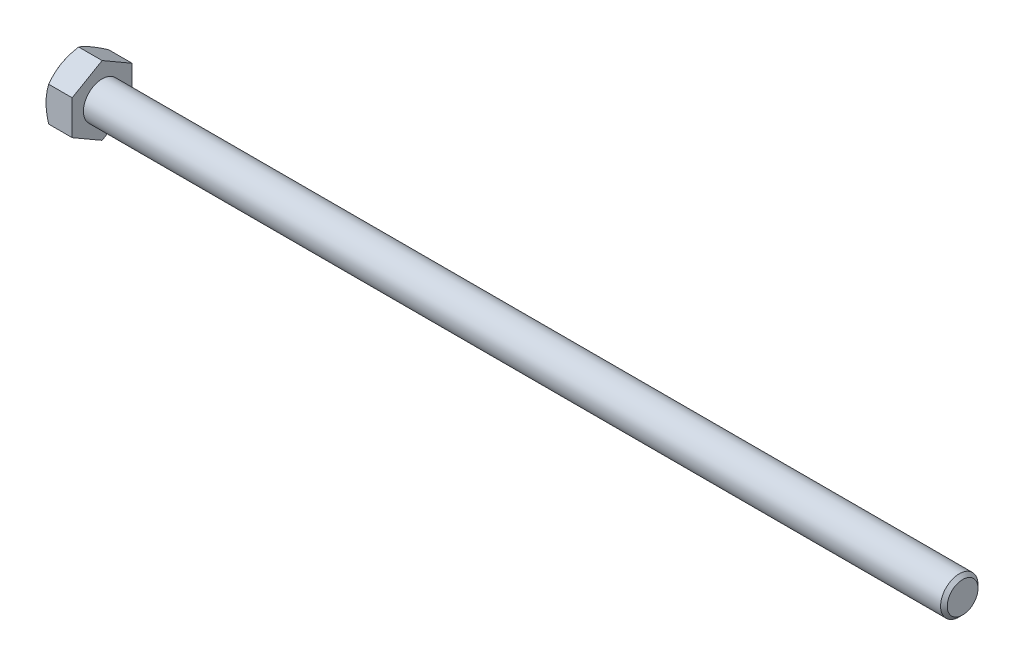
ISO-10303-21;
HEADER;
FILE_DESCRIPTION(('STEP AP214'),'2;1');
FILE_NAME('part.step','',(''),(''),'','','');
FILE_SCHEMA(('AUTOMOTIVE_DESIGN { 1 0 10303 214 1 1 1 1 }'));
ENDSEC;
DATA;
#1=APPLICATION_CONTEXT('core data for automotive mechanical design processes');
#2=APPLICATION_PROTOCOL_DEFINITION('international standard','automotive_design',2000,#1);
#3=PRODUCT_CONTEXT('',#1,'mechanical');
#4=PRODUCT('Part','Part','',(#3));
#5=PRODUCT_RELATED_PRODUCT_CATEGORY('part','',(#4));
#6=PRODUCT_DEFINITION_FORMATION('','',#4);
#7=PRODUCT_DEFINITION_CONTEXT('part definition',#1,'design');
#8=PRODUCT_DEFINITION('design','',#6,#7);
#9=PRODUCT_DEFINITION_SHAPE('','',#8);
#10=(LENGTH_UNIT() NAMED_UNIT(*) SI_UNIT(.MILLI.,.METRE.));
#11=(NAMED_UNIT(*) PLANE_ANGLE_UNIT() SI_UNIT($,.RADIAN.));
#12=(NAMED_UNIT(*) SI_UNIT($,.STERADIAN.) SOLID_ANGLE_UNIT());
#13=UNCERTAINTY_MEASURE_WITH_UNIT(LENGTH_MEASURE(1.E-05),#10,'distance_accuracy_value','');
#14=(GEOMETRIC_REPRESENTATION_CONTEXT(3) GLOBAL_UNCERTAINTY_ASSIGNED_CONTEXT((#13)) GLOBAL_UNIT_ASSIGNED_CONTEXT((#10,
#11,#12)) REPRESENTATION_CONTEXT('',''));
#15=CARTESIAN_POINT('',(0.,0.,0.));
#16=DIRECTION('',(0.,0.,1.));
#17=DIRECTION('',(1.,0.,0.));
#18=AXIS2_PLACEMENT_3D('',#15,#16,#17);
#19=CARTESIAN_POINT('',(3.5,2.3094010767585,-4.));
#20=DIRECTION('',(0.,-0.866025403784438,0.500000000000001));
#21=DIRECTION('',(0.,-0.500000000000001,-0.866025403784438));
#22=AXIS2_PLACEMENT_3D('',#19,#20,#21);
#23=PLANE('',#22);
#24=CARTESIAN_POINT('',(0.357332259074765,4.61891762357085,0.0002));
#25=CARTESIAN_POINT('',(0.298717873648281,4.51743148381381,-0.175579150323228));
#26=CARTESIAN_POINT('',(0.245410321462261,4.41506932144052,-0.352875616326381));
#27=CARTESIAN_POINT('',(0.152361670746403,4.2085725054774,-0.710538593175706));
#28=CARTESIAN_POINT('',(0.112653489029704,4.10443418285647,-0.89091145897015));
#29=CARTESIAN_POINT('',(0.0508422152802794,3.89744813015756,-1.24942181870279));
#30=CARTESIAN_POINT('',(0.0283277315228895,3.7946322465506,-1.42750415293514));
#31=CARTESIAN_POINT('',(0.00145062314658258,3.58851671999023,-1.78450671716651));
#32=CARTESIAN_POINT('',(-0.00293425857305618,3.48521782616117,-1.9634256496441));
#33=CARTESIAN_POINT('',(0.00619007293997031,3.29219970504619,-2.29774284219673));
#34=CARTESIAN_POINT('',(0.017458953987994,3.20245157692487,-2.45319115998706));
#35=CARTESIAN_POINT('',(0.0531739907981923,3.02354002635497,-2.76307505563505));
#36=CARTESIAN_POINT('',(0.0776323457115318,2.93437722268073,-2.91750956174413));
#37=CARTESIAN_POINT('',(0.138776064919287,2.75509682012354,-3.22803232777458));
#38=CARTESIAN_POINT('',(0.175720603654861,2.6650019108942,-3.3840812880631));
#39=CARTESIAN_POINT('',(0.259570072548024,2.48615580200001,-3.69385183540384));
#40=CARTESIAN_POINT('',(0.306455302212736,2.39740231122585,-3.84757739077378));
#41=CARTESIAN_POINT('',(0.357332259074763,2.30928560670467,-4.0002));
#42=B_SPLINE_CURVE_WITH_KNOTS('',3,(#24,#25,#26,#27,#28,#29,#30,#31,#32,#33,#34,#35,#36,#37,#38,
#39,#40,#41),.UNSPECIFIED.,.F.,.F.,(4,2,2,2,2,2,2,2,4),(0.,0.634047835695966,1.26961969224543,
1.88946157213122,2.50854226669297,3.04757825393386,3.58711366126903,4.13861653143764,
4.68903648037743),.UNSPECIFIED.);
#43=CARTESIAN_POINT('',(0.357265589908161,4.61880215351701,0.));
#44=VERTEX_POINT('',#43);
#45=CARTESIAN_POINT('',(0.,3.46410161513775,-2.));
#46=VERTEX_POINT('',#45);
#47=EDGE_CURVE('E50',#44,#46,#42,.T.);
#48=ORIENTED_EDGE('',*,*,#47,.F.);
#49=DIRECTION('',(-1.,0.,0.));
#50=VECTOR('',#49,1.);
#51=CARTESIAN_POINT('',(3.5,4.61880215351701,0.));
#52=LINE('',#51,#50);
#53=CARTESIAN_POINT('',(3.5,4.61880215351701,0.));
#54=VERTEX_POINT('',#53);
#55=EDGE_CURVE('E146',#54,#44,#52,.T.);
#56=ORIENTED_EDGE('',*,*,#55,.F.);
#57=DIRECTION('',(0.,0.500000000000001,0.866025403784438));
#58=VECTOR('',#57,1.);
#59=CARTESIAN_POINT('',(3.5,2.3094010767585,-4.));
#60=LINE('',#59,#58);
#61=CARTESIAN_POINT('',(3.5,2.3094010767585,-4.));
#62=VERTEX_POINT('',#61);
#63=EDGE_CURVE('E231',#62,#54,#60,.T.);
#64=ORIENTED_EDGE('',*,*,#63,.F.);
#65=DIRECTION('',(-1.,0.,0.));
#66=VECTOR('',#65,1.);
#67=CARTESIAN_POINT('',(3.5,2.3094010767585,-4.));
#68=LINE('',#67,#66);
#69=CARTESIAN_POINT('',(0.357265589908158,2.3094010767585,-4.));
#70=VERTEX_POINT('',#69);
#71=EDGE_CURVE('E134',#62,#70,#68,.T.);
#72=ORIENTED_EDGE('',*,*,#71,.T.);
#73=EDGE_CURVE('E128',#46,#70,#42,.T.);
#74=ORIENTED_EDGE('',*,*,#73,.F.);
#75=EDGE_LOOP('',(#48,#56,#64,#72,#74));
#76=FACE_BOUND('',#75,.T.);
#77=ADVANCED_FACE('F34',(#76),#23,.F.);
#78=CARTESIAN_POINT('',(3.5,4.61880215351701,0.));
#79=DIRECTION('',(0.,-0.866025403784438,-0.500000000000001));
#80=DIRECTION('',(0.,0.500000000000001,-0.866025403784438));
#81=AXIS2_PLACEMENT_3D('',#78,#79,#80);
#82=PLANE('',#81);
#83=CARTESIAN_POINT('',(0.357332259074762,2.30928560670466,4.0002));
#84=CARTESIAN_POINT('',(0.298717873648277,2.4107717464617,3.82442084967677));
#85=CARTESIAN_POINT('',(0.245410321462258,2.51313390883499,3.64712438367362));
#86=CARTESIAN_POINT('',(0.152361670746401,2.71963072479811,3.28946140682429));
#87=CARTESIAN_POINT('',(0.112653489029703,2.82376904741904,3.10908854102985));
#88=CARTESIAN_POINT('',(0.0508422152802784,3.03075510011795,2.75057818129721));
#89=CARTESIAN_POINT('',(0.0283277315228881,3.13357098372492,2.57249584706486));
#90=CARTESIAN_POINT('',(0.00145062314658145,3.33968651028528,2.21549328283349));
#91=CARTESIAN_POINT('',(-0.00293425857305672,3.44298540411434,2.0365743503559));
#92=CARTESIAN_POINT('',(0.00619007293997055,3.63600352522932,1.70225715780327));
#93=CARTESIAN_POINT('',(0.0174589539879945,3.72575165335065,1.54680884001294));
#94=CARTESIAN_POINT('',(0.0531739907981932,3.90466320392054,1.23692494436495));
#95=CARTESIAN_POINT('',(0.0776323457115329,3.99382600759479,1.08249043825587));
#96=CARTESIAN_POINT('',(0.138776064919289,4.17310641015197,0.771967672225423));
#97=CARTESIAN_POINT('',(0.175720603654863,4.26320131938131,0.615918711936898));
#98=CARTESIAN_POINT('',(0.259570072548026,4.44204742827551,0.30614816459616));
#99=CARTESIAN_POINT('',(0.306455302212738,4.53080091904967,0.15242260922622));
#100=CARTESIAN_POINT('',(0.357332259074765,4.61891762357085,-0.000200000000000061));
#101=B_SPLINE_CURVE_WITH_KNOTS('',3,(#83,#84,#85,#86,#87,#88,#89,#90,#91,#92,#93,#94,#95,#96,
#97,#98,#99,#100),.UNSPECIFIED.,.F.,.F.,(4,2,2,2,2,2,2,2,4),(0.,0.634047835695965,
1.26961969224543,1.88946157213122,2.50854226669297,3.04757825393385,3.58711366126903,
4.13861653143764,4.68903648037743),.UNSPECIFIED.);
#102=CARTESIAN_POINT('',(0.357265589908157,2.3094010767585,4.));
#103=VERTEX_POINT('',#102);
#104=CARTESIAN_POINT('',(0.,3.46410161513775,2.));
#105=VERTEX_POINT('',#104);
#106=EDGE_CURVE('E57',#103,#105,#101,.T.);
#107=ORIENTED_EDGE('',*,*,#106,.F.);
#108=DIRECTION('',(-1.,0.,0.));
#109=VECTOR('',#108,1.);
#110=CARTESIAN_POINT('',(3.5,2.3094010767585,4.));
#111=LINE('',#110,#109);
#112=CARTESIAN_POINT('',(3.5,2.3094010767585,4.));
#113=VERTEX_POINT('',#112);
#114=EDGE_CURVE('E144',#113,#103,#111,.T.);
#115=ORIENTED_EDGE('',*,*,#114,.F.);
#116=DIRECTION('',(0.,-0.500000000000001,0.866025403784438));
#117=VECTOR('',#116,1.);
#118=CARTESIAN_POINT('',(3.5,4.61880215351701,0.));
#119=LINE('',#118,#117);
#120=EDGE_CURVE('E229',#54,#113,#119,.T.);
#121=ORIENTED_EDGE('',*,*,#120,.F.);
#122=ORIENTED_EDGE('',*,*,#55,.T.);
#123=EDGE_CURVE('E161',#105,#44,#101,.T.);
#124=ORIENTED_EDGE('',*,*,#123,.F.);
#125=EDGE_LOOP('',(#107,#115,#121,#122,#124));
#126=FACE_BOUND('',#125,.T.);
#127=ADVANCED_FACE('F167',(#126),#82,.F.);
#128=CARTESIAN_POINT('',(3.5,2.3094010767585,4.));
#129=DIRECTION('',(0.,0.,-1.));
#130=DIRECTION('',(0.,1.,0.));
#131=AXIS2_PLACEMENT_3D('',#128,#129,#130);
#132=PLANE('',#131);
#133=CARTESIAN_POINT('',(2.00011120589741,-6.30203842761112,4.));
#134=CARTESIAN_POINT('',(1.91454696498873,-6.12645846908574,4.));
#135=CARTESIAN_POINT('',(1.8297751587799,-5.95048585830455,4.));
#136=CARTESIAN_POINT('',(1.66226027831943,-5.59754684504876,4.));
#137=CARTESIAN_POINT('',(1.57951750565515,-5.42058029958677,4.));
#138=CARTESIAN_POINT('',(1.41610926315702,-5.06457985358151,4.));
#139=CARTESIAN_POINT('',(1.33545672742031,-4.88553999633136,4.));
#140=CARTESIAN_POINT('',(1.17732358085362,-4.52607013308824,4.));
#141=CARTESIAN_POINT('',(1.09984282639235,-4.34564019048467,4.));
#142=CARTESIAN_POINT('',(0.946328318347805,-3.97695712450866,4.));
#143=CARTESIAN_POINT('',(0.87043270452968,-3.7886461766802,4.));
#144=CARTESIAN_POINT('',(0.72415021597338,-3.40985798992394,4.));
#145=CARTESIAN_POINT('',(0.653763945273163,-3.21938051607554,4.));
#146=CARTESIAN_POINT('',(0.520275623504076,-2.83628177128504,4.));
#147=CARTESIAN_POINT('',(0.457159651374148,-2.64366539864627,4.));
#148=CARTESIAN_POINT('',(0.340171517554836,-2.25567134331568,4.));
#149=CARTESIAN_POINT('',(0.286296547637715,-2.06029451909569,4.));
#150=CARTESIAN_POINT('',(0.190596079795565,-1.66775019580151,4.));
#151=CARTESIAN_POINT('',(0.148703055516463,-1.47059946092578,4.));
#152=CARTESIAN_POINT('',(0.0792701945625797,-1.07374632347739,4.));
#153=CARTESIAN_POINT('',(0.0517287925825725,-0.874044201615005,4.));
#154=CARTESIAN_POINT('',(0.0135517369810976,-0.475733691865659,4.));
#155=CARTESIAN_POINT('',(0.0026910656815028,-0.277147418102507,4.));
#156=CARTESIAN_POINT('',(-0.00180277185473722,0.120241437274126,4.));
#157=CARTESIAN_POINT('',(0.00456430935448255,0.319044021953529,4.));
#158=CARTESIAN_POINT('',(0.0293199842587317,0.653649133068296,4.));
#159=CARTESIAN_POINT('',(0.0433487696608963,0.789796206499813,4.));
#160=CARTESIAN_POINT('',(0.0786650587211741,1.0611517992991,4.));
#161=CARTESIAN_POINT('',(0.099953465399782,1.1963601997699,4.));
#162=CARTESIAN_POINT('',(0.173595113230304,1.60036108975571,4.));
#163=CARTESIAN_POINT('',(0.23571360986528,1.86739658303733,4.));
#164=CARTESIAN_POINT('',(0.344187907647023,2.26690842404959,4.));
#165=CARTESIAN_POINT('',(0.383434484333358,2.40143348571874,4.));
#166=CARTESIAN_POINT('',(0.466191102609248,2.66917849490937,4.));
#167=CARTESIAN_POINT('',(0.509701177188776,2.80239843232332,4.));
#168=CARTESIAN_POINT('',(0.600271094434189,3.06757339383923,4.));
#169=CARTESIAN_POINT('',(0.647329943862153,3.19952876030406,4.));
#170=CARTESIAN_POINT('',(0.744425096631933,3.46233234223975,4.));
#171=CARTESIAN_POINT('',(0.794461330917678,3.59318058330843,4.));
#172=CARTESIAN_POINT('',(0.933355739925499,3.94627302392213,4.));
#173=CARTESIAN_POINT('',(1.0245987610664,4.16757823857487,4.));
#174=CARTESIAN_POINT('',(1.212472284956,4.60789849928793,4.));
#175=CARTESIAN_POINT('',(1.30910339372387,4.82691328443151,4.));
#176=CARTESIAN_POINT('',(1.50647026715799,5.26317250533757,4.));
#177=CARTESIAN_POINT('',(1.60720747010151,5.48041628821982,4.));
#178=CARTESIAN_POINT('',(1.81181128644257,5.91342831956036,4.));
#179=CARTESIAN_POINT('',(1.91567799687904,6.12919652200918,4.));
#180=CARTESIAN_POINT('',(2.12601769056008,6.55988022094135,4.));
#181=CARTESIAN_POINT('',(2.23249454580639,6.77479382248029,4.));
#182=CARTESIAN_POINT('',(2.44739203770407,7.20364803216286,4.));
#183=CARTESIAN_POINT('',(2.55581269515435,7.4175886298645,4.));
#184=CARTESIAN_POINT('',(2.88334503640576,8.05812603677698,4.));
#185=CARTESIAN_POINT('',(3.10477549508711,8.48353660654961,4.));
#186=CARTESIAN_POINT('',(3.52798949521966,9.287048305686,4.));
#187=CARTESIAN_POINT('',(3.7293579523648,9.66536913109687,4.));
#188=CARTESIAN_POINT('',(4.13451859351913,10.4207405604373,4.));
#189=CARTESIAN_POINT('',(4.33831092861572,10.7977910832854,3.99999999999999));
#190=CARTESIAN_POINT('',(4.74699525708425,11.5496417902084,3.99999999999999));
#191=CARTESIAN_POINT('',(4.9518811941786,11.9244452714923,3.99999999999999));
#192=CARTESIAN_POINT('',(5.36302659718323,12.6732594632006,3.99999999999999));
#193=CARTESIAN_POINT('',(5.56928595205573,13.0472702345667,3.99999999999999));
#194=CARTESIAN_POINT('',(5.77604503500377,13.42100281196,3.99999999999999));
#195=B_SPLINE_CURVE_WITH_KNOTS('',3,(#133,#134,#135,#136,#137,#138,#139,#140,#141,#142,#143,
#144,#145,#146,#147,#148,#149,#150,#151,#152,#153,#154,#155,#156,#157,#158,#159,#160,#161,#162,
#163,#164,#165,#166,#167,#168,#169,#170,#171,#172,#173,#174,#175,#176,#177,#178,#179,#180,#181,
#182,#183,#184,#185,#186,#187,#188,#189,#190,#191,#192,#193,#194),.UNSPECIFIED.,.F.,.F.,(4,2,2,
2,2,2,2,2,2,2,2,2,2,2,2,2,2,2,2,2,2,2,2,2,2,2,2,2,2,2,4),(0.,0.585964080082645,1.1720147339736,
1.76109183587771,2.35014223237614,2.95916537364922,3.56825519425103,4.17615863853846,
4.78387701983943,5.38809979056439,5.99225664601461,6.58818973021546,7.18413137397508,
7.59453803053126,8.00499575598947,8.82630884150173,9.2466697389851,9.66703388938199,
10.0872808210163,10.5075180094363,11.2255416710968,11.9436462552169,12.6620045748536,
13.3803851921263,14.0999050723894,14.8194326561991,16.2581595564571,17.5438734456803,
18.8296679016496,20.1111105471136,21.3924508191106),.UNSPECIFIED.);
#196=CARTESIAN_POINT('',(0.357265589908157,-2.3094010767585,4.));
#197=VERTEX_POINT('',#196);
#198=CARTESIAN_POINT('',(0.,0.,4.));
#199=VERTEX_POINT('',#198);
#200=EDGE_CURVE('E241',#197,#199,#195,.T.);
#201=ORIENTED_EDGE('',*,*,#200,.F.);
#202=DIRECTION('',(-1.,0.,0.));
#203=VECTOR('',#202,1.);
#204=CARTESIAN_POINT('',(3.5,-2.3094010767585,4.));
#205=LINE('',#204,#203);
#206=CARTESIAN_POINT('',(3.5,-2.3094010767585,4.));
#207=VERTEX_POINT('',#206);
#208=EDGE_CURVE('E136',#207,#197,#205,.T.);
#209=ORIENTED_EDGE('',*,*,#208,.F.);
#210=DIRECTION('',(0.,-1.,0.));
#211=VECTOR('',#210,1.);
#212=CARTESIAN_POINT('',(3.5,2.3094010767585,4.));
#213=LINE('',#212,#211);
#214=EDGE_CURVE('E225',#113,#207,#213,.T.);
#215=ORIENTED_EDGE('',*,*,#214,.F.);
#216=ORIENTED_EDGE('',*,*,#114,.T.);
#217=EDGE_CURVE('E183',#199,#103,#195,.T.);
#218=ORIENTED_EDGE('',*,*,#217,.F.);
#219=EDGE_LOOP('',(#201,#209,#215,#216,#218));
#220=FACE_BOUND('',#219,.T.);
#221=ADVANCED_FACE('F247',(#220),#132,.F.);
#222=CARTESIAN_POINT('',(3.5,-4.61880215351701,0.));
#223=DIRECTION('',(0.,0.866025403784438,-0.500000000000001));
#224=DIRECTION('',(0.,0.500000000000001,0.866025403784438));
#225=AXIS2_PLACEMENT_3D('',#222,#223,#224);
#226=PLANE('',#225);
#227=CARTESIAN_POINT('',(0.357332259074763,-4.61891762357084,-0.000200000000000144));
#228=CARTESIAN_POINT('',(0.298717873648279,-4.5174314838138,0.175579150323228));
#229=CARTESIAN_POINT('',(0.245410321462259,-4.41506932144052,0.35287561632638));
#230=CARTESIAN_POINT('',(0.152361670746401,-4.20857250547739,0.710538593175705));
#231=CARTESIAN_POINT('',(0.112653489029702,-4.10443418285647,0.89091145897015));
#232=CARTESIAN_POINT('',(0.0508422152802777,-3.89744813015756,1.24942181870279));
#233=CARTESIAN_POINT('',(0.0283277315228874,-3.79463224655059,1.42750415293514));
#234=CARTESIAN_POINT('',(0.00145062314658024,-3.58851671999023,1.78450671716651));
#235=CARTESIAN_POINT('',(-0.0029342585730584,-3.48521782616117,1.9634256496441));
#236=CARTESIAN_POINT('',(0.00619007293996827,-3.29219970504619,2.29774284219673));
#237=CARTESIAN_POINT('',(0.017458953987992,-3.20245157692486,2.45319115998706));
#238=CARTESIAN_POINT('',(0.0531739907981903,-3.02354002635496,2.76307505563505));
#239=CARTESIAN_POINT('',(0.0776323457115299,-2.93437722268072,2.91750956174413));
#240=CARTESIAN_POINT('',(0.138776064919285,-2.75509682012354,3.22803232777458));
#241=CARTESIAN_POINT('',(0.175720603654859,-2.6650019108942,3.3840812880631));
#242=CARTESIAN_POINT('',(0.259570072548022,-2.486155802,3.69385183540384));
#243=CARTESIAN_POINT('',(0.306455302212734,-2.39740231122584,3.84757739077378));
#244=CARTESIAN_POINT('',(0.357332259074761,-2.30928560670466,4.0002));
#245=B_SPLINE_CURVE_WITH_KNOTS('',3,(#227,#228,#229,#230,#231,#232,#233,#234,#235,#236,#237,
#238,#239,#240,#241,#242,#243,#244),.UNSPECIFIED.,.F.,.F.,(4,2,2,2,2,2,2,2,4),(0.,
0.634047835695965,1.26961969224543,1.88946157213122,2.50854226669297,3.04757825393385,
3.58711366126903,4.13861653143764,4.68903648037743),.UNSPECIFIED.);
#246=CARTESIAN_POINT('',(0.357265589908159,-4.61880215351701,0.));
#247=VERTEX_POINT('',#246);
#248=CARTESIAN_POINT('',(0.,-3.46410161513775,2.));
#249=VERTEX_POINT('',#248);
#250=EDGE_CURVE('E169',#247,#249,#245,.T.);
#251=ORIENTED_EDGE('',*,*,#250,.F.);
#252=DIRECTION('',(-1.,0.,0.));
#253=VECTOR('',#252,1.);
#254=CARTESIAN_POINT('',(3.5,-4.61880215351701,0.));
#255=LINE('',#254,#253);
#256=CARTESIAN_POINT('',(3.5,-4.61880215351701,0.));
#257=VERTEX_POINT('',#256);
#258=EDGE_CURVE('E133',#257,#247,#255,.T.);
#259=ORIENTED_EDGE('',*,*,#258,.F.);
#260=DIRECTION('',(0.,-0.500000000000001,-0.866025403784438));
#261=VECTOR('',#260,1.);
#262=CARTESIAN_POINT('',(3.5,-4.61880215351701,0.));
#263=LINE('',#262,#261);
#264=EDGE_CURVE('E223',#207,#257,#263,.T.);
#265=ORIENTED_EDGE('',*,*,#264,.F.);
#266=ORIENTED_EDGE('',*,*,#208,.T.);
#267=EDGE_CURVE('E171',#249,#197,#245,.T.);
#268=ORIENTED_EDGE('',*,*,#267,.F.);
#269=EDGE_LOOP('',(#251,#259,#265,#266,#268));
#270=FACE_BOUND('',#269,.T.);
#271=ADVANCED_FACE('F219',(#270),#226,.F.);
#272=CARTESIAN_POINT('',(3.5,-2.3094010767585,-4.));
#273=DIRECTION('',(0.,0.866025403784439,0.5));
#274=DIRECTION('',(0.,-0.5,0.866025403784439));
#275=AXIS2_PLACEMENT_3D('',#272,#273,#274);
#276=PLANE('',#275);
#277=CARTESIAN_POINT('',(0.357332259074764,-2.30928560670467,-4.0002));
#278=CARTESIAN_POINT('',(0.298717873648281,-2.41077174646171,-3.82442084967677));
#279=CARTESIAN_POINT('',(0.245410321462261,-2.513133908835,-3.64712438367362));
#280=CARTESIAN_POINT('',(0.152361670746402,-2.71963072479812,-3.2894614068243));
#281=CARTESIAN_POINT('',(0.112653489029703,-2.82376904741904,-3.10908854102985));
#282=CARTESIAN_POINT('',(0.0508422152802788,-3.03075510011795,-2.75057818129721));
#283=CARTESIAN_POINT('',(0.0283277315228891,-3.13357098372492,-2.57249584706486));
#284=CARTESIAN_POINT('',(0.00145062314658242,-3.33968651028528,-2.21549328283349));
#285=CARTESIAN_POINT('',(-0.0029342585730564,-3.44298540411434,-2.0365743503559));
#286=CARTESIAN_POINT('',(0.00619007293997026,-3.63600352522932,-1.70225715780327));
#287=CARTESIAN_POINT('',(0.0174589539879941,-3.72575165335065,-1.54680884001294));
#288=CARTESIAN_POINT('',(0.0531739907981925,-3.90466320392054,-1.23692494436495));
#289=CARTESIAN_POINT('',(0.077632345711532,-3.99382600759478,-1.08249043825587));
#290=CARTESIAN_POINT('',(0.138776064919287,-4.17310641015197,-0.771967672225423));
#291=CARTESIAN_POINT('',(0.175720603654861,-4.26320131938131,-0.615918711936899));
#292=CARTESIAN_POINT('',(0.259570072548024,-4.4420474282755,-0.306148164596161));
#293=CARTESIAN_POINT('',(0.306455302212736,-4.53080091904966,-0.152422609226221));
#294=CARTESIAN_POINT('',(0.357332259074763,-4.61891762357084,0.00019999999999975));
#295=B_SPLINE_CURVE_WITH_KNOTS('',3,(#277,#278,#279,#280,#281,#282,#283,#284,#285,#286,#287,
#288,#289,#290,#291,#292,#293,#294),.UNSPECIFIED.,.F.,.F.,(4,2,2,2,2,2,2,2,4),(0.,
0.634047835695965,1.26961969224543,1.88946157213122,2.50854226669297,3.04757825393386,
3.58711366126903,4.13861653143764,4.68903648037743),.UNSPECIFIED.);
#296=CARTESIAN_POINT('',(0.357265589908042,-2.30940107675868,-4.));
#297=VERTEX_POINT('',#296);
#298=CARTESIAN_POINT('',(0.,-3.46410161513776,-2.));
#299=VERTEX_POINT('',#298);
#300=EDGE_CURVE('E110',#297,#299,#295,.T.);
#301=ORIENTED_EDGE('',*,*,#300,.F.);
#302=DIRECTION('',(-1.,0.,0.));
#303=VECTOR('',#302,1.);
#304=CARTESIAN_POINT('',(3.5,-2.3094010767585,-4.));
#305=LINE('',#304,#303);
#306=CARTESIAN_POINT('',(3.5,-2.3094010767585,-4.));
#307=VERTEX_POINT('',#306);
#308=EDGE_CURVE('E124',#307,#297,#305,.T.);
#309=ORIENTED_EDGE('',*,*,#308,.F.);
#310=DIRECTION('',(0.,0.5,-0.866025403784439));
#311=VECTOR('',#310,1.);
#312=CARTESIAN_POINT('',(3.5,-2.3094010767585,-4.));
#313=LINE('',#312,#311);
#314=EDGE_CURVE('E221',#257,#307,#313,.T.);
#315=ORIENTED_EDGE('',*,*,#314,.F.);
#316=ORIENTED_EDGE('',*,*,#258,.T.);
#317=EDGE_CURVE('E127',#299,#247,#295,.T.);
#318=ORIENTED_EDGE('',*,*,#317,.F.);
#319=EDGE_LOOP('',(#301,#309,#315,#316,#318));
#320=FACE_BOUND('',#319,.T.);
#321=ADVANCED_FACE('F122',(#320),#276,.F.);
#322=CARTESIAN_POINT('',(3.5,2.3094010767585,-4.));
#323=DIRECTION('',(0.,0.,1.));
#324=DIRECTION('',(0.,-1.,0.));
#325=AXIS2_PLACEMENT_3D('',#322,#323,#324);
#326=PLANE('',#325);
#327=CARTESIAN_POINT('',(2.00011120589741,-6.30203842761113,-4.));
#328=CARTESIAN_POINT('',(1.91454696498874,-6.12645846908574,-4.));
#329=CARTESIAN_POINT('',(1.82977515877991,-5.95048585830456,-4.));
#330=CARTESIAN_POINT('',(1.66226027831944,-5.59754684504877,-4.));
#331=CARTESIAN_POINT('',(1.57951750565516,-5.42058029958678,-4.));
#332=CARTESIAN_POINT('',(1.41610926315703,-5.06457985358152,-4.));
#333=CARTESIAN_POINT('',(1.33545672742031,-4.88553999633137,-4.));
#334=CARTESIAN_POINT('',(1.17732358085362,-4.52607013308825,-4.));
#335=CARTESIAN_POINT('',(1.09984282639236,-4.34564019048468,-4.));
#336=CARTESIAN_POINT('',(0.946328318347809,-3.97695712450866,-4.));
#337=CARTESIAN_POINT('',(0.870432704529684,-3.78864617668021,-4.));
#338=CARTESIAN_POINT('',(0.724150215973383,-3.40985798992395,-4.));
#339=CARTESIAN_POINT('',(0.653763945273166,-3.21938051607554,-4.));
#340=CARTESIAN_POINT('',(0.520275623504079,-2.83628177128505,-4.));
#341=CARTESIAN_POINT('',(0.45715965137415,-2.64366539864628,-4.));
#342=CARTESIAN_POINT('',(0.340171517554838,-2.25567134331569,-4.));
#343=CARTESIAN_POINT('',(0.286296547637717,-2.0602945190957,-4.));
#344=CARTESIAN_POINT('',(0.190596079795568,-1.66775019580151,-4.));
#345=CARTESIAN_POINT('',(0.148703055516465,-1.47059946092578,-4.));
#346=CARTESIAN_POINT('',(0.0792701945625814,-1.07374632347739,-4.));
#347=CARTESIAN_POINT('',(0.0517287925825736,-0.87404420161501,-4.));
#348=CARTESIAN_POINT('',(0.0135517369810984,-0.475733691865663,-4.));
#349=CARTESIAN_POINT('',(0.00269106568150387,-0.27714741810251,-4.));
#350=CARTESIAN_POINT('',(-0.00180277185473627,0.120241437274123,-4.));
#351=CARTESIAN_POINT('',(0.00456430935448313,0.319044021953525,-4.));
#352=CARTESIAN_POINT('',(0.0293199842587321,0.653649133068293,-4.));
#353=CARTESIAN_POINT('',(0.0433487696608968,0.78979620649981,-4.));
#354=CARTESIAN_POINT('',(0.0786650587211747,1.0611517992991,-4.));
#355=CARTESIAN_POINT('',(0.0999534653997825,1.1963601997699,-4.));
#356=CARTESIAN_POINT('',(0.173595113230304,1.60036108975571,-4.));
#357=CARTESIAN_POINT('',(0.235713609865279,1.86739658303732,-4.));
#358=CARTESIAN_POINT('',(0.344187907647023,2.26690842404959,-4.));
#359=CARTESIAN_POINT('',(0.383434484333359,2.40143348571873,-4.));
#360=CARTESIAN_POINT('',(0.466191102609249,2.66917849490936,-4.));
#361=CARTESIAN_POINT('',(0.509701177188776,2.80239843232332,-4.));
#362=CARTESIAN_POINT('',(0.600271094434189,3.06757339383923,-4.));
#363=CARTESIAN_POINT('',(0.647329943862153,3.19952876030406,-4.));
#364=CARTESIAN_POINT('',(0.744425096631933,3.46233234223975,-4.));
#365=CARTESIAN_POINT('',(0.794461330917678,3.59318058330843,-4.));
#366=CARTESIAN_POINT('',(0.9333557399255,3.94627302392213,-4.));
#367=CARTESIAN_POINT('',(1.0245987610664,4.16757823857487,-4.));
#368=CARTESIAN_POINT('',(1.212472284956,4.60789849928793,-4.));
#369=CARTESIAN_POINT('',(1.30910339372388,4.82691328443151,-4.));
#370=CARTESIAN_POINT('',(1.50647026715799,5.26317250533758,-4.));
#371=CARTESIAN_POINT('',(1.60720747010151,5.48041628821982,-4.));
#372=CARTESIAN_POINT('',(1.81181128644257,5.91342831956036,-4.));
#373=CARTESIAN_POINT('',(1.91567799687904,6.12919652200918,-4.));
#374=CARTESIAN_POINT('',(2.12601769056008,6.55988022094136,-4.));
#375=CARTESIAN_POINT('',(2.23249454580639,6.77479382248029,-4.));
#376=CARTESIAN_POINT('',(2.44739203770407,7.20364803216286,-4.));
#377=CARTESIAN_POINT('',(2.55581269515435,7.4175886298645,-4.));
#378=CARTESIAN_POINT('',(2.88334503640576,8.05812603677698,-4.));
#379=CARTESIAN_POINT('',(3.10477549508712,8.48353660654961,-4.));
#380=CARTESIAN_POINT('',(3.52798949521966,9.28704830568601,-4.));
#381=CARTESIAN_POINT('',(3.7293579523648,9.66536913109688,-4.));
#382=CARTESIAN_POINT('',(4.13451859351914,10.4207405604373,-4.));
#383=CARTESIAN_POINT('',(4.33831092861573,10.7977910832854,-4.));
#384=CARTESIAN_POINT('',(4.74699525708426,11.5496417902084,-4.));
#385=CARTESIAN_POINT('',(4.9518811941786,11.9244452714923,-4.));
#386=CARTESIAN_POINT('',(5.36302659718324,12.6732594632006,-4.));
#387=CARTESIAN_POINT('',(5.56928595205573,13.0472702345667,-4.));
#388=CARTESIAN_POINT('',(5.77604503500377,13.42100281196,-4.));
#389=B_SPLINE_CURVE_WITH_KNOTS('',3,(#327,#328,#329,#330,#331,#332,#333,#334,#335,#336,#337,
#338,#339,#340,#341,#342,#343,#344,#345,#346,#347,#348,#349,#350,#351,#352,#353,#354,#355,#356,
#357,#358,#359,#360,#361,#362,#363,#364,#365,#366,#367,#368,#369,#370,#371,#372,#373,#374,#375,
#376,#377,#378,#379,#380,#381,#382,#383,#384,#385,#386,#387,#388),.UNSPECIFIED.,.F.,.F.,(4,2,2,
2,2,2,2,2,2,2,2,2,2,2,2,2,2,2,2,2,2,2,2,2,2,2,2,2,2,2,4),(0.,0.585964080082644,1.1720147339736,
1.76109183587771,2.35014223237614,2.95916537364923,3.56825519425103,4.17615863853846,
4.78387701983943,5.38809979056439,5.99225664601462,6.58818973021546,7.18413137397509,
7.59453803053127,8.00499575598948,8.82630884150174,9.24666973898511,9.667033889382,
10.0872808210163,10.5075180094363,11.2255416710968,11.9436462552169,12.6620045748536,
13.3803851921263,14.0999050723895,14.8194326561991,16.2581595564571,17.5438734456804,
18.8296679016496,20.1111105471137,21.3924508191106),.UNSPECIFIED.);
#390=CARTESIAN_POINT('',(0.,0.,-4.));
#391=VERTEX_POINT('',#390);
#392=EDGE_CURVE('E116',#70,#391,#389,.F.);
#393=ORIENTED_EDGE('',*,*,#392,.F.);
#394=ORIENTED_EDGE('',*,*,#71,.F.);
#395=DIRECTION('',(0.,1.,0.));
#396=VECTOR('',#395,1.);
#397=CARTESIAN_POINT('',(3.5,2.3094010767585,-4.));
#398=LINE('',#397,#396);
#399=EDGE_CURVE('E132',#307,#62,#398,.T.);
#400=ORIENTED_EDGE('',*,*,#399,.F.);
#401=ORIENTED_EDGE('',*,*,#308,.T.);
#402=EDGE_CURVE('E107',#391,#297,#389,.F.);
#403=ORIENTED_EDGE('',*,*,#402,.F.);
#404=EDGE_LOOP('',(#393,#394,#400,#401,#403));
#405=FACE_BOUND('',#404,.T.);
#406=ADVANCED_FACE('F130',(#405),#326,.F.);
#407=CARTESIAN_POINT('',(3.5,4.61880215351701,0.));
#408=DIRECTION('',(1.,0.,0.));
#409=DIRECTION('',(0.,0.,-1.));
#410=AXIS2_PLACEMENT_3D('',#407,#408,#409);
#411=PLANE('',#410);
#412=ORIENTED_EDGE('',*,*,#63,.T.);
#413=ORIENTED_EDGE('',*,*,#120,.T.);
#414=ORIENTED_EDGE('',*,*,#214,.T.);
#415=ORIENTED_EDGE('',*,*,#264,.T.);
#416=ORIENTED_EDGE('',*,*,#314,.T.);
#417=ORIENTED_EDGE('',*,*,#399,.T.);
#418=EDGE_LOOP('',(#412,#413,#414,#415,#416,#417));
#419=FACE_BOUND('',#418,.T.);
#420=CARTESIAN_POINT('',(3.5,0.,0.));
#421=DIRECTION('',(1.,0.,0.));
#422=DIRECTION('',(0.,0.,-1.));
#423=AXIS2_PLACEMENT_3D('',#420,#421,#422);
#424=CIRCLE('',#423,2.5);
#425=CARTESIAN_POINT('',(3.5,0.,-2.5));
#426=VERTEX_POINT('',#425);
#427=EDGE_CURVE('E234',#426,#426,#424,.F.);
#428=ORIENTED_EDGE('',*,*,#427,.T.);
#429=EDGE_LOOP('',(#428));
#430=FACE_BOUND('',#429,.T.);
#431=ADVANCED_FACE('F249',(#419,#430),#411,.T.);
#432=CARTESIAN_POINT('',(0.,0.,0.));
#433=DIRECTION('',(-1.,0.,0.));
#434=DIRECTION('',(0.,0.,1.));
#435=AXIS2_PLACEMENT_3D('',#432,#433,#434);
#436=CYLINDRICAL_SURFACE('',#435,2.5);
#437=ORIENTED_EDGE('',*,*,#427,.F.);
#438=EDGE_LOOP('',(#437));
#439=FACE_BOUND('',#438,.T.);
#440=CARTESIAN_POINT('',(118.055,0.,0.));
#441=DIRECTION('',(-1.,0.,0.));
#442=DIRECTION('',(0.,0.,1.));
#443=AXIS2_PLACEMENT_3D('',#440,#441,#442);
#444=CIRCLE('',#443,2.5);
#445=CARTESIAN_POINT('',(118.055,0.,2.5));
#446=VERTEX_POINT('',#445);
#447=EDGE_CURVE('E237',#446,#446,#444,.T.);
#448=ORIENTED_EDGE('',*,*,#447,.T.);
#449=EDGE_LOOP('',(#448));
#450=FACE_BOUND('',#449,.T.);
#451=ADVANCED_FACE('F280',(#439,#450),#436,.T.);
#452=CARTESIAN_POINT('',(118.5,0.,0.));
#453=DIRECTION('',(-1.,0.,0.));
#454=DIRECTION('',(0.,0.,1.));
#455=AXIS2_PLACEMENT_3D('',#452,#453,#454);
#456=CONICAL_SURFACE('',#455,2.055,0.785398163397447);
#457=ORIENTED_EDGE('',*,*,#447,.F.);
#458=EDGE_LOOP('',(#457));
#459=FACE_BOUND('',#458,.T.);
#460=CARTESIAN_POINT('',(118.5,0.,0.));
#461=DIRECTION('',(-1.,0.,0.));
#462=DIRECTION('',(0.,0.,1.));
#463=AXIS2_PLACEMENT_3D('',#460,#461,#462);
#464=CIRCLE('',#463,2.055);
#465=CARTESIAN_POINT('',(118.5,0.,2.055));
#466=VERTEX_POINT('',#465);
#467=EDGE_CURVE('E239',#466,#466,#464,.T.);
#468=ORIENTED_EDGE('',*,*,#467,.T.);
#469=EDGE_LOOP('',(#468));
#470=FACE_BOUND('',#469,.T.);
#471=ADVANCED_FACE('F283',(#459,#470),#456,.T.);
#472=CARTESIAN_POINT('',(118.5,0.,0.));
#473=DIRECTION('',(-1.,0.,0.));
#474=DIRECTION('',(0.,0.,1.));
#475=AXIS2_PLACEMENT_3D('',#472,#473,#474);
#476=PLANE('',#475);
#477=ORIENTED_EDGE('',*,*,#467,.F.);
#478=EDGE_LOOP('',(#477));
#479=FACE_BOUND('',#478,.T.);
#480=ADVANCED_FACE('F196',(#479),#476,.F.);
#481=CARTESIAN_POINT('',(0.,0.,0.));
#482=DIRECTION('',(1.,0.,0.));
#483=DIRECTION('',(0.,0.,-1.));
#484=AXIS2_PLACEMENT_3D('',#481,#482,#483);
#485=CONICAL_SURFACE('',#484,4.,1.0471975511966);
#486=ORIENTED_EDGE('',*,*,#300,.T.);
#487=CARTESIAN_POINT('',(0.,0.,0.));
#488=DIRECTION('',(1.,0.,0.));
#489=DIRECTION('',(0.,0.,-1.));
#490=AXIS2_PLACEMENT_3D('',#487,#488,#489);
#491=CIRCLE('',#490,4.);
#492=EDGE_CURVE('E38',#299,#391,#491,.T.);
#493=ORIENTED_EDGE('',*,*,#492,.T.);
#494=ORIENTED_EDGE('',*,*,#402,.T.);
#495=EDGE_LOOP('',(#486,#493,#494));
#496=FACE_BOUND('',#495,.T.);
#497=ADVANCED_FACE('F109',(#496),#485,.T.);
#498=ORIENTED_EDGE('',*,*,#250,.T.);
#499=EDGE_CURVE('E151',#249,#299,#491,.T.);
#500=ORIENTED_EDGE('',*,*,#499,.T.);
#501=ORIENTED_EDGE('',*,*,#317,.T.);
#502=EDGE_LOOP('',(#498,#500,#501));
#503=FACE_BOUND('',#502,.T.);
#504=ADVANCED_FACE('F195',(#503),#485,.T.);
#505=ORIENTED_EDGE('',*,*,#200,.T.);
#506=EDGE_CURVE('E152',#199,#249,#491,.T.);
#507=ORIENTED_EDGE('',*,*,#506,.T.);
#508=ORIENTED_EDGE('',*,*,#267,.T.);
#509=EDGE_LOOP('',(#505,#507,#508));
#510=FACE_BOUND('',#509,.T.);
#511=ADVANCED_FACE('F190',(#510),#485,.T.);
#512=ORIENTED_EDGE('',*,*,#217,.T.);
#513=ORIENTED_EDGE('',*,*,#106,.T.);
#514=CARTESIAN_POINT('',(0.,0.,0.));
#515=DIRECTION('',(-1.,0.,0.));
#516=DIRECTION('',(0.,0.,1.));
#517=AXIS2_PLACEMENT_3D('',#514,#515,#516);
#518=CIRCLE('',#517,4.);
#519=EDGE_CURVE('E117',#199,#105,#518,.T.);
#520=ORIENTED_EDGE('',*,*,#519,.F.);
#521=EDGE_LOOP('',(#512,#513,#520));
#522=FACE_BOUND('',#521,.T.);
#523=ADVANCED_FACE('F194',(#522),#485,.T.);
#524=ORIENTED_EDGE('',*,*,#123,.T.);
#525=ORIENTED_EDGE('',*,*,#47,.T.);
#526=EDGE_CURVE('E43',#46,#105,#491,.T.);
#527=ORIENTED_EDGE('',*,*,#526,.T.);
#528=EDGE_LOOP('',(#524,#525,#527));
#529=FACE_BOUND('',#528,.T.);
#530=ADVANCED_FACE('F160',(#529),#485,.T.);
#531=ORIENTED_EDGE('',*,*,#73,.T.);
#532=ORIENTED_EDGE('',*,*,#392,.T.);
#533=EDGE_CURVE('E11',#391,#46,#491,.T.);
#534=ORIENTED_EDGE('',*,*,#533,.T.);
#535=EDGE_LOOP('',(#531,#532,#534));
#536=FACE_BOUND('',#535,.T.);
#537=ADVANCED_FACE('F253',(#536),#485,.T.);
#538=CARTESIAN_POINT('',(0.,4.61880215351701,0.));
#539=DIRECTION('',(1.,0.,0.));
#540=DIRECTION('',(0.,0.,-1.));
#541=AXIS2_PLACEMENT_3D('',#538,#539,#540);
#542=PLANE('',#541);
#543=ORIENTED_EDGE('',*,*,#533,.F.);
#544=ORIENTED_EDGE('',*,*,#492,.F.);
#545=ORIENTED_EDGE('',*,*,#499,.F.);
#546=ORIENTED_EDGE('',*,*,#506,.F.);
#547=ORIENTED_EDGE('',*,*,#519,.T.);
#548=ORIENTED_EDGE('',*,*,#526,.F.);
#549=EDGE_LOOP('',(#543,#544,#545,#546,#547,#548));
#550=FACE_BOUND('',#549,.T.);
#551=ADVANCED_FACE('F164',(#550),#542,.F.);
#552=CLOSED_SHELL('',(#77,#127,#221,#271,#321,#406,#431,#451,#471,#480,#497,#504,#511,#523,#530,
#537,#551));
#553=MANIFOLD_SOLID_BREP('B2',#552);
#554=ADVANCED_BREP_SHAPE_REPRESENTATION('',(#18,#553),#14);
#555=SHAPE_DEFINITION_REPRESENTATION(#9,#554);
ENDSEC;
END-ISO-10303-21;
